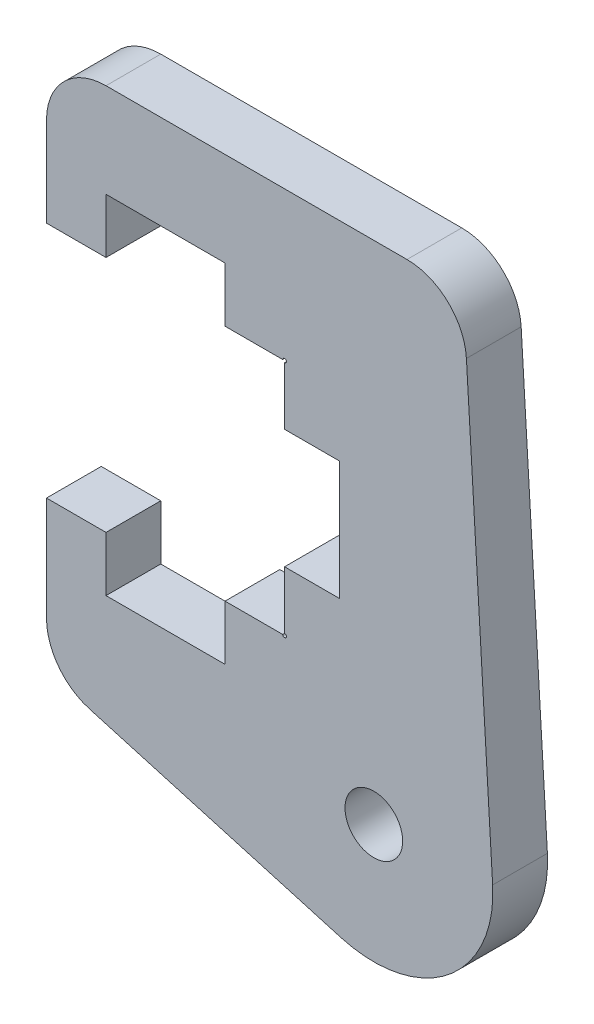
ISO-10303-21;
HEADER;
FILE_DESCRIPTION(('STEP AP214'),'2;1');
FILE_NAME('part.step','',(''),(''),'','','');
FILE_SCHEMA(('AUTOMOTIVE_DESIGN { 1 0 10303 214 1 1 1 1 }'));
ENDSEC;
DATA;
#1=APPLICATION_CONTEXT('core data for automotive mechanical design processes');
#2=APPLICATION_PROTOCOL_DEFINITION('international standard','automotive_design',2000,#1);
#3=PRODUCT_CONTEXT('',#1,'mechanical');
#4=PRODUCT('Part','Part','',(#3));
#5=PRODUCT_RELATED_PRODUCT_CATEGORY('part','',(#4));
#6=PRODUCT_DEFINITION_FORMATION('','',#4);
#7=PRODUCT_DEFINITION_CONTEXT('part definition',#1,'design');
#8=PRODUCT_DEFINITION('design','',#6,#7);
#9=PRODUCT_DEFINITION_SHAPE('','',#8);
#10=(LENGTH_UNIT() NAMED_UNIT(*) SI_UNIT(.MILLI.,.METRE.));
#11=(NAMED_UNIT(*) PLANE_ANGLE_UNIT() SI_UNIT($,.RADIAN.));
#12=(NAMED_UNIT(*) SI_UNIT($,.STERADIAN.) SOLID_ANGLE_UNIT());
#13=UNCERTAINTY_MEASURE_WITH_UNIT(LENGTH_MEASURE(1.E-05),#10,'distance_accuracy_value','');
#14=(GEOMETRIC_REPRESENTATION_CONTEXT(3) GLOBAL_UNCERTAINTY_ASSIGNED_CONTEXT((#13)) GLOBAL_UNIT_ASSIGNED_CONTEXT((#10,
#11,#12)) REPRESENTATION_CONTEXT('',''));
#15=CARTESIAN_POINT('',(0.,0.,0.));
#16=DIRECTION('',(0.,0.,1.));
#17=DIRECTION('',(1.,0.,0.));
#18=AXIS2_PLACEMENT_3D('',#15,#16,#17);
#19=CARTESIAN_POINT('',(22.225,-25.4,5.842));
#20=DIRECTION('',(0.,0.,1.));
#21=DIRECTION('',(1.,0.,0.));
#22=AXIS2_PLACEMENT_3D('',#19,#20,#21);
#23=PLANE('',#22);
#24=CARTESIAN_POINT('',(12.7,-12.7,5.842));
#25=DIRECTION('',(0.,0.,1.));
#26=DIRECTION('',(1.,0.,0.));
#27=AXIS2_PLACEMENT_3D('',#24,#25,#26);
#28=CIRCLE('',#27,0.1984375);
#29=CARTESIAN_POINT('',(12.5015625,-12.7,5.842));
#30=VERTEX_POINT('',#29);
#31=CARTESIAN_POINT('',(12.7,-12.5015625,5.842));
#32=VERTEX_POINT('',#31);
#33=EDGE_CURVE('E205',#30,#32,#28,.T.);
#34=ORIENTED_EDGE('',*,*,#33,.F.);
#35=DIRECTION('',(-1.,0.,0.));
#36=VECTOR('',#35,1.);
#37=CARTESIAN_POINT('',(12.7,-12.7,5.842));
#38=LINE('',#37,#36);
#39=CARTESIAN_POINT('',(6.35,-12.7,5.842));
#40=VERTEX_POINT('',#39);
#41=EDGE_CURVE('E227',#30,#40,#38,.T.);
#42=ORIENTED_EDGE('',*,*,#41,.T.);
#43=DIRECTION('',(0.,-1.,0.));
#44=VECTOR('',#43,1.);
#45=CARTESIAN_POINT('',(6.35,-18.542,5.842));
#46=LINE('',#45,#44);
#47=CARTESIAN_POINT('',(6.35,-18.542,5.842));
#48=VERTEX_POINT('',#47);
#49=EDGE_CURVE('E229',#40,#48,#46,.T.);
#50=ORIENTED_EDGE('',*,*,#49,.T.);
#51=DIRECTION('',(-1.,0.,0.));
#52=VECTOR('',#51,1.);
#53=CARTESIAN_POINT('',(6.35,-18.542,5.842));
#54=LINE('',#53,#52);
#55=CARTESIAN_POINT('',(-6.35,-18.542,5.842));
#56=VERTEX_POINT('',#55);
#57=EDGE_CURVE('E236',#48,#56,#54,.T.);
#58=ORIENTED_EDGE('',*,*,#57,.T.);
#59=DIRECTION('',(0.,1.,0.));
#60=VECTOR('',#59,1.);
#61=CARTESIAN_POINT('',(-6.35,-18.542,5.842));
#62=LINE('',#61,#60);
#63=CARTESIAN_POINT('',(-6.35,-12.7,5.842));
#64=VERTEX_POINT('',#63);
#65=EDGE_CURVE('E238',#56,#64,#62,.T.);
#66=ORIENTED_EDGE('',*,*,#65,.T.);
#67=DIRECTION('',(-1.,0.,0.));
#68=VECTOR('',#67,1.);
#69=CARTESIAN_POINT('',(-6.35,-12.7,5.842));
#70=LINE('',#69,#68);
#71=CARTESIAN_POINT('',(-12.7,-12.7,5.842));
#72=VERTEX_POINT('',#71);
#73=EDGE_CURVE('E240',#64,#72,#70,.T.);
#74=ORIENTED_EDGE('',*,*,#73,.T.);
#75=DIRECTION('',(0.,-1.,0.));
#76=VECTOR('',#75,1.);
#77=CARTESIAN_POINT('',(-12.7,-12.7,5.842));
#78=LINE('',#77,#76);
#79=CARTESIAN_POINT('',(-12.7,-23.7931832403155,5.842));
#80=VERTEX_POINT('',#79);
#81=EDGE_CURVE('E242',#72,#80,#78,.T.);
#82=ORIENTED_EDGE('',*,*,#81,.T.);
#83=CARTESIAN_POINT('',(-6.35000000000001,-23.7931832403155,5.842));
#84=DIRECTION('',(0.,0.,1.));
#85=DIRECTION('',(1.,0.,0.));
#86=AXIS2_PLACEMENT_3D('',#83,#84,#85);
#87=CIRCLE('',#86,6.35);
#88=CARTESIAN_POINT('',(-8.10428482462896,-29.896050169397,5.842));
#89=VERTEX_POINT('',#88);
#90=EDGE_CURVE('E367',#80,#89,#87,.T.);
#91=ORIENTED_EDGE('',*,*,#90,.T.);
#92=DIRECTION('',(0.961081406154566,-0.276265326713221,0.));
#93=VECTOR('',#92,1.);
#94=CARTESIAN_POINT('',(-12.7,-28.575,5.842));
#95=LINE('',#94,#93);
#96=CARTESIAN_POINT('',(18.7164303507421,-37.605733858163,5.842));
#97=VERTEX_POINT('',#96);
#98=EDGE_CURVE('E245',#89,#97,#95,.T.);
#99=ORIENTED_EDGE('',*,*,#98,.T.);
#100=CARTESIAN_POINT('',(22.225,-25.4,5.842));
#101=DIRECTION('',(0.,0.,1.));
#102=DIRECTION('',(1.,0.,0.));
#103=AXIS2_PLACEMENT_3D('',#100,#101,#102);
#104=CIRCLE('',#103,12.7);
#105=CARTESIAN_POINT('',(34.9027769435131,-24.64901946062,5.842));
#106=VERTEX_POINT('',#105);
#107=EDGE_CURVE('E247',#97,#106,#104,.T.);
#108=ORIENTED_EDGE('',*,*,#107,.T.);
#109=DIRECTION('',(-0.0591323259354364,0.998250153032528,0.));
#110=VECTOR('',#109,1.);
#111=CARTESIAN_POINT('',(31.75,28.575,5.842));
#112=LINE('',#111,#110);
#113=CARTESIAN_POINT('',(32.1039059379093,22.60049026969,5.842));
#114=VERTEX_POINT('',#113);
#115=EDGE_CURVE('E249',#106,#114,#112,.T.);
#116=ORIENTED_EDGE('',*,*,#115,.T.);
#117=CARTESIAN_POINT('',(25.7650174661528,22.225,5.842));
#118=DIRECTION('',(0.,0.,1.));
#119=DIRECTION('',(1.,0.,0.));
#120=AXIS2_PLACEMENT_3D('',#117,#118,#119);
#121=CIRCLE('',#120,6.35);
#122=CARTESIAN_POINT('',(25.7650174661528,28.575,5.842));
#123=VERTEX_POINT('',#122);
#124=EDGE_CURVE('E369',#114,#123,#121,.T.);
#125=ORIENTED_EDGE('',*,*,#124,.T.);
#126=DIRECTION('',(-1.,0.,0.));
#127=VECTOR('',#126,1.);
#128=CARTESIAN_POINT('',(-12.7,28.575,5.842));
#129=LINE('',#128,#127);
#130=CARTESIAN_POINT('',(-6.35,28.575,5.842));
#131=VERTEX_POINT('',#130);
#132=EDGE_CURVE('E252',#123,#131,#129,.T.);
#133=ORIENTED_EDGE('',*,*,#132,.T.);
#134=CARTESIAN_POINT('',(-6.35,22.225,5.842));
#135=DIRECTION('',(0.,0.,1.));
#136=DIRECTION('',(1.,0.,0.));
#137=AXIS2_PLACEMENT_3D('',#134,#135,#136);
#138=CIRCLE('',#137,6.35);
#139=CARTESIAN_POINT('',(-12.7,22.225,5.842));
#140=VERTEX_POINT('',#139);
#141=EDGE_CURVE('E365',#131,#140,#138,.T.);
#142=ORIENTED_EDGE('',*,*,#141,.T.);
#143=DIRECTION('',(0.,-1.,0.));
#144=VECTOR('',#143,1.);
#145=CARTESIAN_POINT('',(-12.7,12.7,5.842));
#146=LINE('',#145,#144);
#147=CARTESIAN_POINT('',(-12.7,12.7,5.842));
#148=VERTEX_POINT('',#147);
#149=EDGE_CURVE('E255',#140,#148,#146,.T.);
#150=ORIENTED_EDGE('',*,*,#149,.T.);
#151=DIRECTION('',(1.,0.,0.));
#152=VECTOR('',#151,1.);
#153=CARTESIAN_POINT('',(-6.35,12.7,5.842));
#154=LINE('',#153,#152);
#155=CARTESIAN_POINT('',(-6.35,12.7,5.842));
#156=VERTEX_POINT('',#155);
#157=EDGE_CURVE('E305',#148,#156,#154,.T.);
#158=ORIENTED_EDGE('',*,*,#157,.T.);
#159=DIRECTION('',(0.,1.,0.));
#160=VECTOR('',#159,1.);
#161=CARTESIAN_POINT('',(-6.35,18.542,5.842));
#162=LINE('',#161,#160);
#163=CARTESIAN_POINT('',(-6.35,18.542,5.842));
#164=VERTEX_POINT('',#163);
#165=EDGE_CURVE('E412',#156,#164,#162,.T.);
#166=ORIENTED_EDGE('',*,*,#165,.T.);
#167=DIRECTION('',(1.,0.,0.));
#168=VECTOR('',#167,1.);
#169=CARTESIAN_POINT('',(6.35,18.542,5.842));
#170=LINE('',#169,#168);
#171=CARTESIAN_POINT('',(6.35,18.542,5.842));
#172=VERTEX_POINT('',#171);
#173=EDGE_CURVE('E410',#164,#172,#170,.T.);
#174=ORIENTED_EDGE('',*,*,#173,.T.);
#175=DIRECTION('',(0.,-1.,0.));
#176=VECTOR('',#175,1.);
#177=CARTESIAN_POINT('',(6.35,18.542,5.842));
#178=LINE('',#177,#176);
#179=CARTESIAN_POINT('',(6.35,12.7,5.842));
#180=VERTEX_POINT('',#179);
#181=EDGE_CURVE('E408',#172,#180,#178,.T.);
#182=ORIENTED_EDGE('',*,*,#181,.T.);
#183=DIRECTION('',(1.,0.,0.));
#184=VECTOR('',#183,1.);
#185=CARTESIAN_POINT('',(12.7,12.7,5.842));
#186=LINE('',#185,#184);
#187=CARTESIAN_POINT('',(12.5015625,12.7,5.842));
#188=VERTEX_POINT('',#187);
#189=EDGE_CURVE('E405',#180,#188,#186,.T.);
#190=ORIENTED_EDGE('',*,*,#189,.T.);
#191=CARTESIAN_POINT('',(12.7,12.7,5.842));
#192=DIRECTION('',(0.,0.,1.));
#193=DIRECTION('',(1.,0.,0.));
#194=AXIS2_PLACEMENT_3D('',#191,#192,#193);
#195=CIRCLE('',#194,0.198437499999998);
#196=CARTESIAN_POINT('',(12.7,12.5015625,5.842));
#197=VERTEX_POINT('',#196);
#198=EDGE_CURVE('E221',#197,#188,#195,.T.);
#199=ORIENTED_EDGE('',*,*,#198,.F.);
#200=DIRECTION('',(0.,-1.,0.));
#201=VECTOR('',#200,1.);
#202=CARTESIAN_POINT('',(12.7,6.35,5.842));
#203=LINE('',#202,#201);
#204=CARTESIAN_POINT('',(12.7,6.35,5.842));
#205=VERTEX_POINT('',#204);
#206=EDGE_CURVE('E383',#197,#205,#203,.T.);
#207=ORIENTED_EDGE('',*,*,#206,.T.);
#208=DIRECTION('',(1.,0.,0.));
#209=VECTOR('',#208,1.);
#210=CARTESIAN_POINT('',(18.542,6.35,5.842));
#211=LINE('',#210,#209);
#212=CARTESIAN_POINT('',(18.542,6.35,5.842));
#213=VERTEX_POINT('',#212);
#214=EDGE_CURVE('E401',#205,#213,#211,.T.);
#215=ORIENTED_EDGE('',*,*,#214,.T.);
#216=DIRECTION('',(0.,-1.,0.));
#217=VECTOR('',#216,1.);
#218=CARTESIAN_POINT('',(18.542,-6.35,5.842));
#219=LINE('',#218,#217);
#220=CARTESIAN_POINT('',(18.542,-6.35,5.842));
#221=VERTEX_POINT('',#220);
#222=EDGE_CURVE('E231',#213,#221,#219,.T.);
#223=ORIENTED_EDGE('',*,*,#222,.T.);
#224=DIRECTION('',(-1.,0.,0.));
#225=VECTOR('',#224,1.);
#226=CARTESIAN_POINT('',(18.542,-6.35,5.842));
#227=LINE('',#226,#225);
#228=CARTESIAN_POINT('',(12.7,-6.35,5.842));
#229=VERTEX_POINT('',#228);
#230=EDGE_CURVE('E225',#221,#229,#227,.T.);
#231=ORIENTED_EDGE('',*,*,#230,.T.);
#232=DIRECTION('',(0.,-1.,0.));
#233=VECTOR('',#232,1.);
#234=CARTESIAN_POINT('',(12.7,-12.7,5.842));
#235=LINE('',#234,#233);
#236=EDGE_CURVE('E218',#229,#32,#235,.T.);
#237=ORIENTED_EDGE('',*,*,#236,.T.);
#238=EDGE_LOOP('',(#34,#42,#50,#58,#66,#74,#82,#91,#99,#108,#116,#125,#133,#142,#150,#158,#166,
#174,#182,#190,#199,#207,#215,#223,#231,#237));
#239=FACE_BOUND('',#238,.T.);
#240=CARTESIAN_POINT('',(22.225,-25.4,5.842));
#241=DIRECTION('',(0.,0.,1.));
#242=DIRECTION('',(1.,0.,0.));
#243=AXIS2_PLACEMENT_3D('',#240,#241,#242);
#244=CIRCLE('',#243,3.075);
#245=CARTESIAN_POINT('',(25.3,-25.4,5.842));
#246=VERTEX_POINT('',#245);
#247=EDGE_CURVE('E262',#246,#246,#244,.T.);
#248=ORIENTED_EDGE('',*,*,#247,.F.);
#249=EDGE_LOOP('',(#248));
#250=FACE_BOUND('',#249,.T.);
#251=ADVANCED_FACE('F35',(#239,#250),#23,.T.);
#252=CARTESIAN_POINT('',(22.225,-25.4,0.));
#253=DIRECTION('',(0.,0.,1.));
#254=DIRECTION('',(1.,0.,0.));
#255=AXIS2_PLACEMENT_3D('',#252,#253,#254);
#256=PLANE('',#255);
#257=DIRECTION('',(-1.,0.,0.));
#258=VECTOR('',#257,1.);
#259=CARTESIAN_POINT('',(12.7,-12.7,0.));
#260=LINE('',#259,#258);
#261=CARTESIAN_POINT('',(12.5015625,-12.7,0.));
#262=VERTEX_POINT('',#261);
#263=CARTESIAN_POINT('',(6.35,-12.7,0.));
#264=VERTEX_POINT('',#263);
#265=EDGE_CURVE('E280',#262,#264,#260,.T.);
#266=ORIENTED_EDGE('',*,*,#265,.F.);
#267=CARTESIAN_POINT('',(12.7,-12.7,0.));
#268=DIRECTION('',(0.,0.,1.));
#269=DIRECTION('',(1.,0.,0.));
#270=AXIS2_PLACEMENT_3D('',#267,#268,#269);
#271=CIRCLE('',#270,0.1984375);
#272=CARTESIAN_POINT('',(12.7,-12.5015625,0.));
#273=VERTEX_POINT('',#272);
#274=EDGE_CURVE('E50',#262,#273,#271,.T.);
#275=ORIENTED_EDGE('',*,*,#274,.T.);
#276=DIRECTION('',(0.,-1.,0.));
#277=VECTOR('',#276,1.);
#278=CARTESIAN_POINT('',(12.7,-12.7,0.));
#279=LINE('',#278,#277);
#280=CARTESIAN_POINT('',(12.7,-6.35,0.));
#281=VERTEX_POINT('',#280);
#282=EDGE_CURVE('E220',#281,#273,#279,.T.);
#283=ORIENTED_EDGE('',*,*,#282,.F.);
#284=DIRECTION('',(-1.,0.,0.));
#285=VECTOR('',#284,1.);
#286=CARTESIAN_POINT('',(18.542,-6.35,0.));
#287=LINE('',#286,#285);
#288=CARTESIAN_POINT('',(18.542,-6.35,0.));
#289=VERTEX_POINT('',#288);
#290=EDGE_CURVE('E277',#289,#281,#287,.T.);
#291=ORIENTED_EDGE('',*,*,#290,.F.);
#292=DIRECTION('',(0.,-1.,0.));
#293=VECTOR('',#292,1.);
#294=CARTESIAN_POINT('',(18.542,-6.35,0.));
#295=LINE('',#294,#293);
#296=CARTESIAN_POINT('',(18.542,6.35,0.));
#297=VERTEX_POINT('',#296);
#298=EDGE_CURVE('E275',#297,#289,#295,.T.);
#299=ORIENTED_EDGE('',*,*,#298,.F.);
#300=DIRECTION('',(1.,0.,0.));
#301=VECTOR('',#300,1.);
#302=CARTESIAN_POINT('',(18.542,6.35,0.));
#303=LINE('',#302,#301);
#304=CARTESIAN_POINT('',(12.7,6.35,0.));
#305=VERTEX_POINT('',#304);
#306=EDGE_CURVE('E273',#305,#297,#303,.T.);
#307=ORIENTED_EDGE('',*,*,#306,.F.);
#308=DIRECTION('',(0.,-1.,0.));
#309=VECTOR('',#308,1.);
#310=CARTESIAN_POINT('',(12.7,6.35,0.));
#311=LINE('',#310,#309);
#312=CARTESIAN_POINT('',(12.7,12.5015625,0.));
#313=VERTEX_POINT('',#312);
#314=EDGE_CURVE('E271',#313,#305,#311,.T.);
#315=ORIENTED_EDGE('',*,*,#314,.F.);
#316=CARTESIAN_POINT('',(12.7,12.7,0.));
#317=DIRECTION('',(0.,0.,1.));
#318=DIRECTION('',(1.,0.,0.));
#319=AXIS2_PLACEMENT_3D('',#316,#317,#318);
#320=CIRCLE('',#319,0.198437499999998);
#321=CARTESIAN_POINT('',(12.5015625,12.7,0.));
#322=VERTEX_POINT('',#321);
#323=EDGE_CURVE('E57',#313,#322,#320,.T.);
#324=ORIENTED_EDGE('',*,*,#323,.T.);
#325=DIRECTION('',(1.,0.,0.));
#326=VECTOR('',#325,1.);
#327=CARTESIAN_POINT('',(12.7,12.7,0.));
#328=LINE('',#327,#326);
#329=CARTESIAN_POINT('',(6.35,12.7,0.));
#330=VERTEX_POINT('',#329);
#331=EDGE_CURVE('E268',#330,#322,#328,.T.);
#332=ORIENTED_EDGE('',*,*,#331,.F.);
#333=DIRECTION('',(0.,-1.,0.));
#334=VECTOR('',#333,1.);
#335=CARTESIAN_POINT('',(6.35,18.542,0.));
#336=LINE('',#335,#334);
#337=CARTESIAN_POINT('',(6.35,18.542,0.));
#338=VERTEX_POINT('',#337);
#339=EDGE_CURVE('E266',#338,#330,#336,.T.);
#340=ORIENTED_EDGE('',*,*,#339,.F.);
#341=DIRECTION('',(1.,0.,0.));
#342=VECTOR('',#341,1.);
#343=CARTESIAN_POINT('',(6.35,18.542,0.));
#344=LINE('',#343,#342);
#345=CARTESIAN_POINT('',(-6.35,18.542,0.));
#346=VERTEX_POINT('',#345);
#347=EDGE_CURVE('E264',#346,#338,#344,.T.);
#348=ORIENTED_EDGE('',*,*,#347,.F.);
#349=DIRECTION('',(0.,1.,0.));
#350=VECTOR('',#349,1.);
#351=CARTESIAN_POINT('',(-6.35,18.542,0.));
#352=LINE('',#351,#350);
#353=CARTESIAN_POINT('',(-6.35,12.7,0.));
#354=VERTEX_POINT('',#353);
#355=EDGE_CURVE('E261',#354,#346,#352,.T.);
#356=ORIENTED_EDGE('',*,*,#355,.F.);
#357=DIRECTION('',(1.,0.,0.));
#358=VECTOR('',#357,1.);
#359=CARTESIAN_POINT('',(-6.35,12.7,0.));
#360=LINE('',#359,#358);
#361=CARTESIAN_POINT('',(-12.7,12.7,0.));
#362=VERTEX_POINT('',#361);
#363=EDGE_CURVE('E258',#362,#354,#360,.T.);
#364=ORIENTED_EDGE('',*,*,#363,.F.);
#365=DIRECTION('',(0.,-1.,0.));
#366=VECTOR('',#365,1.);
#367=CARTESIAN_POINT('',(-12.7,12.7,0.));
#368=LINE('',#367,#366);
#369=CARTESIAN_POINT('',(-12.7,22.225,0.));
#370=VERTEX_POINT('',#369);
#371=EDGE_CURVE('E303',#370,#362,#368,.T.);
#372=ORIENTED_EDGE('',*,*,#371,.F.);
#373=CARTESIAN_POINT('',(-6.35,22.225,0.));
#374=DIRECTION('',(0.,0.,1.));
#375=DIRECTION('',(1.,0.,0.));
#376=AXIS2_PLACEMENT_3D('',#373,#374,#375);
#377=CIRCLE('',#376,6.35);
#378=CARTESIAN_POINT('',(-6.35,28.575,0.));
#379=VERTEX_POINT('',#378);
#380=EDGE_CURVE('E357',#370,#379,#377,.F.);
#381=ORIENTED_EDGE('',*,*,#380,.T.);
#382=DIRECTION('',(-1.,0.,0.));
#383=VECTOR('',#382,1.);
#384=CARTESIAN_POINT('',(-12.7,28.575,0.));
#385=LINE('',#384,#383);
#386=CARTESIAN_POINT('',(25.7650174661528,28.575,0.));
#387=VERTEX_POINT('',#386);
#388=EDGE_CURVE('E300',#387,#379,#385,.T.);
#389=ORIENTED_EDGE('',*,*,#388,.F.);
#390=CARTESIAN_POINT('',(25.7650174661528,22.225,0.));
#391=DIRECTION('',(0.,0.,1.));
#392=DIRECTION('',(1.,0.,0.));
#393=AXIS2_PLACEMENT_3D('',#390,#391,#392);
#394=CIRCLE('',#393,6.35);
#395=CARTESIAN_POINT('',(32.1039059379093,22.60049026969,0.));
#396=VERTEX_POINT('',#395);
#397=EDGE_CURVE('E361',#387,#396,#394,.F.);
#398=ORIENTED_EDGE('',*,*,#397,.T.);
#399=DIRECTION('',(-0.0591323259354364,0.998250153032528,0.));
#400=VECTOR('',#399,1.);
#401=CARTESIAN_POINT('',(31.75,28.575,0.));
#402=LINE('',#401,#400);
#403=CARTESIAN_POINT('',(34.9027769435131,-24.64901946062,0.));
#404=VERTEX_POINT('',#403);
#405=EDGE_CURVE('E297',#404,#396,#402,.T.);
#406=ORIENTED_EDGE('',*,*,#405,.F.);
#407=CARTESIAN_POINT('',(22.225,-25.4,0.));
#408=DIRECTION('',(0.,0.,1.));
#409=DIRECTION('',(1.,0.,0.));
#410=AXIS2_PLACEMENT_3D('',#407,#408,#409);
#411=CIRCLE('',#410,12.7);
#412=CARTESIAN_POINT('',(18.7164303507421,-37.605733858163,0.));
#413=VERTEX_POINT('',#412);
#414=EDGE_CURVE('E295',#413,#404,#411,.T.);
#415=ORIENTED_EDGE('',*,*,#414,.F.);
#416=DIRECTION('',(0.961081406154566,-0.276265326713221,0.));
#417=VECTOR('',#416,1.);
#418=CARTESIAN_POINT('',(-12.7,-28.575,0.));
#419=LINE('',#418,#417);
#420=CARTESIAN_POINT('',(-8.10428482462896,-29.896050169397,0.));
#421=VERTEX_POINT('',#420);
#422=EDGE_CURVE('E293',#421,#413,#419,.T.);
#423=ORIENTED_EDGE('',*,*,#422,.F.);
#424=CARTESIAN_POINT('',(-6.35000000000001,-23.7931832403155,0.));
#425=DIRECTION('',(0.,0.,1.));
#426=DIRECTION('',(1.,0.,0.));
#427=AXIS2_PLACEMENT_3D('',#424,#425,#426);
#428=CIRCLE('',#427,6.35);
#429=CARTESIAN_POINT('',(-12.7,-23.7931832403155,0.));
#430=VERTEX_POINT('',#429);
#431=EDGE_CURVE('E359',#421,#430,#428,.F.);
#432=ORIENTED_EDGE('',*,*,#431,.T.);
#433=DIRECTION('',(0.,-1.,0.));
#434=VECTOR('',#433,1.);
#435=CARTESIAN_POINT('',(-12.7,-12.7,0.));
#436=LINE('',#435,#434);
#437=CARTESIAN_POINT('',(-12.7,-12.7,0.));
#438=VERTEX_POINT('',#437);
#439=EDGE_CURVE('E290',#438,#430,#436,.T.);
#440=ORIENTED_EDGE('',*,*,#439,.F.);
#441=DIRECTION('',(-1.,0.,0.));
#442=VECTOR('',#441,1.);
#443=CARTESIAN_POINT('',(-6.35,-12.7,0.));
#444=LINE('',#443,#442);
#445=CARTESIAN_POINT('',(-6.35,-12.7,0.));
#446=VERTEX_POINT('',#445);
#447=EDGE_CURVE('E288',#446,#438,#444,.T.);
#448=ORIENTED_EDGE('',*,*,#447,.F.);
#449=DIRECTION('',(0.,1.,0.));
#450=VECTOR('',#449,1.);
#451=CARTESIAN_POINT('',(-6.35,-18.542,0.));
#452=LINE('',#451,#450);
#453=CARTESIAN_POINT('',(-6.35,-18.542,0.));
#454=VERTEX_POINT('',#453);
#455=EDGE_CURVE('E286',#454,#446,#452,.T.);
#456=ORIENTED_EDGE('',*,*,#455,.F.);
#457=DIRECTION('',(-1.,0.,0.));
#458=VECTOR('',#457,1.);
#459=CARTESIAN_POINT('',(6.35,-18.542,0.));
#460=LINE('',#459,#458);
#461=CARTESIAN_POINT('',(6.35,-18.542,0.));
#462=VERTEX_POINT('',#461);
#463=EDGE_CURVE('E284',#462,#454,#460,.T.);
#464=ORIENTED_EDGE('',*,*,#463,.F.);
#465=DIRECTION('',(0.,-1.,0.));
#466=VECTOR('',#465,1.);
#467=CARTESIAN_POINT('',(6.35,-18.542,0.));
#468=LINE('',#467,#466);
#469=EDGE_CURVE('E282',#264,#462,#468,.T.);
#470=ORIENTED_EDGE('',*,*,#469,.F.);
#471=EDGE_LOOP('',(#266,#275,#283,#291,#299,#307,#315,#324,#332,#340,#348,#356,#364,#372,#381,
#389,#398,#406,#415,#423,#432,#440,#448,#456,#464,#470));
#472=FACE_BOUND('',#471,.T.);
#473=CARTESIAN_POINT('',(22.225,-25.4,0.));
#474=DIRECTION('',(0.,0.,1.));
#475=DIRECTION('',(1.,0.,0.));
#476=AXIS2_PLACEMENT_3D('',#473,#474,#475);
#477=CIRCLE('',#476,3.075);
#478=CARTESIAN_POINT('',(25.3,-25.4,0.));
#479=VERTEX_POINT('',#478);
#480=EDGE_CURVE('E416',#479,#479,#477,.T.);
#481=ORIENTED_EDGE('',*,*,#480,.T.);
#482=EDGE_LOOP('',(#481));
#483=FACE_BOUND('',#482,.T.);
#484=ADVANCED_FACE('F388',(#472,#483),#256,.F.);
#485=CARTESIAN_POINT('',(-6.35,12.7,5.842));
#486=DIRECTION('',(0.,1.,0.));
#487=DIRECTION('',(-1.,0.,0.));
#488=AXIS2_PLACEMENT_3D('',#485,#486,#487);
#489=PLANE('',#488);
#490=ORIENTED_EDGE('',*,*,#363,.T.);
#491=DIRECTION('',(0.,0.,-1.));
#492=VECTOR('',#491,1.);
#493=CARTESIAN_POINT('',(-6.35,12.7,5.842));
#494=LINE('',#493,#492);
#495=EDGE_CURVE('E349',#156,#354,#494,.T.);
#496=ORIENTED_EDGE('',*,*,#495,.F.);
#497=ORIENTED_EDGE('',*,*,#157,.F.);
#498=DIRECTION('',(0.,0.,-1.));
#499=VECTOR('',#498,1.);
#500=CARTESIAN_POINT('',(-12.7,12.7,5.842));
#501=LINE('',#500,#499);
#502=EDGE_CURVE('E257',#148,#362,#501,.T.);
#503=ORIENTED_EDGE('',*,*,#502,.T.);
#504=EDGE_LOOP('',(#490,#496,#497,#503));
#505=FACE_BOUND('',#504,.T.);
#506=ADVANCED_FACE('F494',(#505),#489,.F.);
#507=CARTESIAN_POINT('',(-6.35,18.542,5.842));
#508=DIRECTION('',(-1.,0.,0.));
#509=DIRECTION('',(0.,0.,1.));
#510=AXIS2_PLACEMENT_3D('',#507,#508,#509);
#511=PLANE('',#510);
#512=ORIENTED_EDGE('',*,*,#355,.T.);
#513=DIRECTION('',(0.,0.,-1.));
#514=VECTOR('',#513,1.);
#515=CARTESIAN_POINT('',(-6.35,18.542,5.842));
#516=LINE('',#515,#514);
#517=EDGE_CURVE('E346',#164,#346,#516,.T.);
#518=ORIENTED_EDGE('',*,*,#517,.F.);
#519=ORIENTED_EDGE('',*,*,#165,.F.);
#520=ORIENTED_EDGE('',*,*,#495,.T.);
#521=EDGE_LOOP('',(#512,#518,#519,#520));
#522=FACE_BOUND('',#521,.T.);
#523=ADVANCED_FACE('F496',(#522),#511,.F.);
#524=CARTESIAN_POINT('',(6.35,18.542,5.842));
#525=DIRECTION('',(0.,1.,0.));
#526=DIRECTION('',(0.,0.,1.));
#527=AXIS2_PLACEMENT_3D('',#524,#525,#526);
#528=PLANE('',#527);
#529=ORIENTED_EDGE('',*,*,#347,.T.);
#530=DIRECTION('',(0.,0.,-1.));
#531=VECTOR('',#530,1.);
#532=CARTESIAN_POINT('',(6.35,18.542,5.842));
#533=LINE('',#532,#531);
#534=EDGE_CURVE('E343',#172,#338,#533,.T.);
#535=ORIENTED_EDGE('',*,*,#534,.F.);
#536=ORIENTED_EDGE('',*,*,#173,.F.);
#537=ORIENTED_EDGE('',*,*,#517,.T.);
#538=EDGE_LOOP('',(#529,#535,#536,#537));
#539=FACE_BOUND('',#538,.T.);
#540=ADVANCED_FACE('F501',(#539),#528,.F.);
#541=CARTESIAN_POINT('',(6.35,18.542,5.842));
#542=DIRECTION('',(1.,0.,0.));
#543=DIRECTION('',(0.,1.,0.));
#544=AXIS2_PLACEMENT_3D('',#541,#542,#543);
#545=PLANE('',#544);
#546=ORIENTED_EDGE('',*,*,#339,.T.);
#547=DIRECTION('',(0.,0.,-1.));
#548=VECTOR('',#547,1.);
#549=CARTESIAN_POINT('',(6.35,12.7,5.842));
#550=LINE('',#549,#548);
#551=EDGE_CURVE('E340',#180,#330,#550,.T.);
#552=ORIENTED_EDGE('',*,*,#551,.F.);
#553=ORIENTED_EDGE('',*,*,#181,.F.);
#554=ORIENTED_EDGE('',*,*,#534,.T.);
#555=EDGE_LOOP('',(#546,#552,#553,#554));
#556=FACE_BOUND('',#555,.T.);
#557=ADVANCED_FACE('F506',(#556),#545,.F.);
#558=CARTESIAN_POINT('',(12.7,12.7,5.842));
#559=DIRECTION('',(0.,1.,0.));
#560=DIRECTION('',(-1.,0.,0.));
#561=AXIS2_PLACEMENT_3D('',#558,#559,#560);
#562=PLANE('',#561);
#563=ORIENTED_EDGE('',*,*,#331,.T.);
#564=DIRECTION('',(0.,0.,1.));
#565=VECTOR('',#564,1.);
#566=CARTESIAN_POINT('',(12.5015625,12.7,0.));
#567=LINE('',#566,#565);
#568=EDGE_CURVE('E419',#322,#188,#567,.T.);
#569=ORIENTED_EDGE('',*,*,#568,.T.);
#570=ORIENTED_EDGE('',*,*,#189,.F.);
#571=ORIENTED_EDGE('',*,*,#551,.T.);
#572=EDGE_LOOP('',(#563,#569,#570,#571));
#573=FACE_BOUND('',#572,.T.);
#574=ADVANCED_FACE('F509',(#573),#562,.F.);
#575=CARTESIAN_POINT('',(12.7,6.35,5.842));
#576=DIRECTION('',(1.,0.,0.));
#577=DIRECTION('',(0.,0.,-1.));
#578=AXIS2_PLACEMENT_3D('',#575,#576,#577);
#579=PLANE('',#578);
#580=ORIENTED_EDGE('',*,*,#206,.F.);
#581=DIRECTION('',(0.,0.,1.));
#582=VECTOR('',#581,1.);
#583=CARTESIAN_POINT('',(12.7,12.5015625,0.));
#584=LINE('',#583,#582);
#585=EDGE_CURVE('E43',#197,#313,#584,.F.);
#586=ORIENTED_EDGE('',*,*,#585,.T.);
#587=ORIENTED_EDGE('',*,*,#314,.T.);
#588=DIRECTION('',(0.,0.,-1.));
#589=VECTOR('',#588,1.);
#590=CARTESIAN_POINT('',(12.7,6.35,5.842));
#591=LINE('',#590,#589);
#592=EDGE_CURVE('E337',#205,#305,#591,.T.);
#593=ORIENTED_EDGE('',*,*,#592,.F.);
#594=EDGE_LOOP('',(#580,#586,#587,#593));
#595=FACE_BOUND('',#594,.T.);
#596=ADVANCED_FACE('F381',(#595),#579,.F.);
#597=CARTESIAN_POINT('',(18.542,6.35,5.842));
#598=DIRECTION('',(0.,1.,0.));
#599=DIRECTION('',(0.,0.,1.));
#600=AXIS2_PLACEMENT_3D('',#597,#598,#599);
#601=PLANE('',#600);
#602=ORIENTED_EDGE('',*,*,#306,.T.);
#603=DIRECTION('',(0.,0.,-1.));
#604=VECTOR('',#603,1.);
#605=CARTESIAN_POINT('',(18.542,6.35,5.842));
#606=LINE('',#605,#604);
#607=EDGE_CURVE('E334',#213,#297,#606,.T.);
#608=ORIENTED_EDGE('',*,*,#607,.F.);
#609=ORIENTED_EDGE('',*,*,#214,.F.);
#610=ORIENTED_EDGE('',*,*,#592,.T.);
#611=EDGE_LOOP('',(#602,#608,#609,#610));
#612=FACE_BOUND('',#611,.T.);
#613=ADVANCED_FACE('F395',(#612),#601,.F.);
#614=CARTESIAN_POINT('',(18.542,-6.35,5.842));
#615=DIRECTION('',(1.,0.,0.));
#616=DIRECTION('',(0.,0.,-1.));
#617=AXIS2_PLACEMENT_3D('',#614,#615,#616);
#618=PLANE('',#617);
#619=ORIENTED_EDGE('',*,*,#298,.T.);
#620=DIRECTION('',(0.,0.,-1.));
#621=VECTOR('',#620,1.);
#622=CARTESIAN_POINT('',(18.542,-6.35,5.842));
#623=LINE('',#622,#621);
#624=EDGE_CURVE('E331',#221,#289,#623,.T.);
#625=ORIENTED_EDGE('',*,*,#624,.F.);
#626=ORIENTED_EDGE('',*,*,#222,.F.);
#627=ORIENTED_EDGE('',*,*,#607,.T.);
#628=EDGE_LOOP('',(#619,#625,#626,#627));
#629=FACE_BOUND('',#628,.T.);
#630=ADVANCED_FACE('F399',(#629),#618,.F.);
#631=CARTESIAN_POINT('',(18.542,-6.35,5.842));
#632=DIRECTION('',(0.,-1.,0.));
#633=DIRECTION('',(0.,0.,-1.));
#634=AXIS2_PLACEMENT_3D('',#631,#632,#633);
#635=PLANE('',#634);
#636=ORIENTED_EDGE('',*,*,#290,.T.);
#637=DIRECTION('',(0.,0.,-1.));
#638=VECTOR('',#637,1.);
#639=CARTESIAN_POINT('',(12.7,-6.35,5.842));
#640=LINE('',#639,#638);
#641=EDGE_CURVE('E329',#229,#281,#640,.T.);
#642=ORIENTED_EDGE('',*,*,#641,.F.);
#643=ORIENTED_EDGE('',*,*,#230,.F.);
#644=ORIENTED_EDGE('',*,*,#624,.T.);
#645=EDGE_LOOP('',(#636,#642,#643,#644));
#646=FACE_BOUND('',#645,.T.);
#647=ADVANCED_FACE('F552',(#646),#635,.F.);
#648=CARTESIAN_POINT('',(12.7,-12.7,5.842));
#649=DIRECTION('',(1.,0.,0.));
#650=DIRECTION('',(0.,0.,-1.));
#651=AXIS2_PLACEMENT_3D('',#648,#649,#650);
#652=PLANE('',#651);
#653=ORIENTED_EDGE('',*,*,#282,.T.);
#654=DIRECTION('',(0.,0.,1.));
#655=VECTOR('',#654,1.);
#656=CARTESIAN_POINT('',(12.7,-12.5015625,0.));
#657=LINE('',#656,#655);
#658=EDGE_CURVE('E208',#273,#32,#657,.T.);
#659=ORIENTED_EDGE('',*,*,#658,.T.);
#660=ORIENTED_EDGE('',*,*,#236,.F.);
#661=ORIENTED_EDGE('',*,*,#641,.T.);
#662=EDGE_LOOP('',(#653,#659,#660,#661));
#663=FACE_BOUND('',#662,.T.);
#664=ADVANCED_FACE('F216',(#663),#652,.F.);
#665=CARTESIAN_POINT('',(12.7,-12.7,5.842));
#666=DIRECTION('',(0.,-1.,0.));
#667=DIRECTION('',(1.,0.,0.));
#668=AXIS2_PLACEMENT_3D('',#665,#666,#667);
#669=PLANE('',#668);
#670=ORIENTED_EDGE('',*,*,#41,.F.);
#671=DIRECTION('',(0.,0.,1.));
#672=VECTOR('',#671,1.);
#673=CARTESIAN_POINT('',(12.5015625,-12.7,0.));
#674=LINE('',#673,#672);
#675=EDGE_CURVE('E11',#30,#262,#674,.F.);
#676=ORIENTED_EDGE('',*,*,#675,.T.);
#677=ORIENTED_EDGE('',*,*,#265,.T.);
#678=DIRECTION('',(0.,0.,-1.));
#679=VECTOR('',#678,1.);
#680=CARTESIAN_POINT('',(6.35,-12.7,5.842));
#681=LINE('',#680,#679);
#682=EDGE_CURVE('E326',#40,#264,#681,.T.);
#683=ORIENTED_EDGE('',*,*,#682,.F.);
#684=EDGE_LOOP('',(#670,#676,#677,#683));
#685=FACE_BOUND('',#684,.T.);
#686=ADVANCED_FACE('F430',(#685),#669,.F.);
#687=CARTESIAN_POINT('',(6.35,-18.542,5.842));
#688=DIRECTION('',(1.,0.,0.));
#689=DIRECTION('',(0.,1.,0.));
#690=AXIS2_PLACEMENT_3D('',#687,#688,#689);
#691=PLANE('',#690);
#692=ORIENTED_EDGE('',*,*,#469,.T.);
#693=DIRECTION('',(0.,0.,-1.));
#694=VECTOR('',#693,1.);
#695=CARTESIAN_POINT('',(6.35,-18.542,5.842));
#696=LINE('',#695,#694);
#697=EDGE_CURVE('E323',#48,#462,#696,.T.);
#698=ORIENTED_EDGE('',*,*,#697,.F.);
#699=ORIENTED_EDGE('',*,*,#49,.F.);
#700=ORIENTED_EDGE('',*,*,#682,.T.);
#701=EDGE_LOOP('',(#692,#698,#699,#700));
#702=FACE_BOUND('',#701,.T.);
#703=ADVANCED_FACE('F433',(#702),#691,.F.);
#704=CARTESIAN_POINT('',(6.35,-18.542,5.842));
#705=DIRECTION('',(0.,-1.,0.));
#706=DIRECTION('',(1.,0.,0.));
#707=AXIS2_PLACEMENT_3D('',#704,#705,#706);
#708=PLANE('',#707);
#709=ORIENTED_EDGE('',*,*,#463,.T.);
#710=DIRECTION('',(0.,0.,-1.));
#711=VECTOR('',#710,1.);
#712=CARTESIAN_POINT('',(-6.35,-18.542,5.842));
#713=LINE('',#712,#711);
#714=EDGE_CURVE('E320',#56,#454,#713,.T.);
#715=ORIENTED_EDGE('',*,*,#714,.F.);
#716=ORIENTED_EDGE('',*,*,#57,.F.);
#717=ORIENTED_EDGE('',*,*,#697,.T.);
#718=EDGE_LOOP('',(#709,#715,#716,#717));
#719=FACE_BOUND('',#718,.T.);
#720=ADVANCED_FACE('F440',(#719),#708,.F.);
#721=CARTESIAN_POINT('',(-6.35,-18.542,5.842));
#722=DIRECTION('',(-1.,0.,0.));
#723=DIRECTION('',(0.,-1.,0.));
#724=AXIS2_PLACEMENT_3D('',#721,#722,#723);
#725=PLANE('',#724);
#726=ORIENTED_EDGE('',*,*,#455,.T.);
#727=DIRECTION('',(0.,0.,-1.));
#728=VECTOR('',#727,1.);
#729=CARTESIAN_POINT('',(-6.35,-12.7,5.842));
#730=LINE('',#729,#728);
#731=EDGE_CURVE('E317',#64,#446,#730,.T.);
#732=ORIENTED_EDGE('',*,*,#731,.F.);
#733=ORIENTED_EDGE('',*,*,#65,.F.);
#734=ORIENTED_EDGE('',*,*,#714,.T.);
#735=EDGE_LOOP('',(#726,#732,#733,#734));
#736=FACE_BOUND('',#735,.T.);
#737=ADVANCED_FACE('F443',(#736),#725,.F.);
#738=CARTESIAN_POINT('',(-6.35,-12.7,5.842));
#739=DIRECTION('',(0.,-1.,0.));
#740=DIRECTION('',(1.,0.,0.));
#741=AXIS2_PLACEMENT_3D('',#738,#739,#740);
#742=PLANE('',#741);
#743=ORIENTED_EDGE('',*,*,#447,.T.);
#744=DIRECTION('',(0.,0.,-1.));
#745=VECTOR('',#744,1.);
#746=CARTESIAN_POINT('',(-12.7,-12.7,5.842));
#747=LINE('',#746,#745);
#748=EDGE_CURVE('E314',#72,#438,#747,.T.);
#749=ORIENTED_EDGE('',*,*,#748,.F.);
#750=ORIENTED_EDGE('',*,*,#73,.F.);
#751=ORIENTED_EDGE('',*,*,#731,.T.);
#752=EDGE_LOOP('',(#743,#749,#750,#751));
#753=FACE_BOUND('',#752,.T.);
#754=ADVANCED_FACE('F448',(#753),#742,.F.);
#755=CARTESIAN_POINT('',(-12.7,-12.7,5.842));
#756=DIRECTION('',(1.,0.,0.));
#757=DIRECTION('',(0.,1.,0.));
#758=AXIS2_PLACEMENT_3D('',#755,#756,#757);
#759=PLANE('',#758);
#760=ORIENTED_EDGE('',*,*,#439,.T.);
#761=DIRECTION('',(0.,0.,-1.));
#762=VECTOR('',#761,1.);
#763=CARTESIAN_POINT('',(-12.7,-23.7931832403155,5.842));
#764=LINE('',#763,#762);
#765=EDGE_CURVE('E374',#430,#80,#764,.F.);
#766=ORIENTED_EDGE('',*,*,#765,.T.);
#767=ORIENTED_EDGE('',*,*,#81,.F.);
#768=ORIENTED_EDGE('',*,*,#748,.T.);
#769=EDGE_LOOP('',(#760,#766,#767,#768));
#770=FACE_BOUND('',#769,.T.);
#771=ADVANCED_FACE('F537',(#770),#759,.F.);
#772=CARTESIAN_POINT('',(-12.7,-28.575,5.842));
#773=DIRECTION('',(0.276265326713221,0.961081406154566,0.));
#774=DIRECTION('',(-0.961081406154566,0.276265326713221,0.));
#775=AXIS2_PLACEMENT_3D('',#772,#773,#774);
#776=PLANE('',#775);
#777=ORIENTED_EDGE('',*,*,#98,.F.);
#778=DIRECTION('',(0.,0.,-1.));
#779=VECTOR('',#778,1.);
#780=CARTESIAN_POINT('',(-8.10428482462896,-29.896050169397,5.842));
#781=LINE('',#780,#779);
#782=EDGE_CURVE('E371',#89,#421,#781,.T.);
#783=ORIENTED_EDGE('',*,*,#782,.T.);
#784=ORIENTED_EDGE('',*,*,#422,.T.);
#785=DIRECTION('',(0.,0.,-1.));
#786=VECTOR('',#785,1.);
#787=CARTESIAN_POINT('',(18.7164303507421,-37.605733858163,5.842));
#788=LINE('',#787,#786);
#789=EDGE_CURVE('E311',#97,#413,#788,.T.);
#790=ORIENTED_EDGE('',*,*,#789,.F.);
#791=EDGE_LOOP('',(#777,#783,#784,#790));
#792=FACE_BOUND('',#791,.T.);
#793=ADVANCED_FACE('F459',(#792),#776,.F.);
#794=CARTESIAN_POINT('',(22.225,-25.4,5.842));
#795=DIRECTION('',(0.,0.,-1.));
#796=DIRECTION('',(-1.,0.,0.));
#797=AXIS2_PLACEMENT_3D('',#794,#795,#796);
#798=CYLINDRICAL_SURFACE('',#797,12.7);
#799=ORIENTED_EDGE('',*,*,#414,.T.);
#800=DIRECTION('',(0.,0.,-1.));
#801=VECTOR('',#800,1.);
#802=CARTESIAN_POINT('',(34.9027769435131,-24.64901946062,5.842));
#803=LINE('',#802,#801);
#804=EDGE_CURVE('E308',#106,#404,#803,.T.);
#805=ORIENTED_EDGE('',*,*,#804,.F.);
#806=ORIENTED_EDGE('',*,*,#107,.F.);
#807=ORIENTED_EDGE('',*,*,#789,.T.);
#808=EDGE_LOOP('',(#799,#805,#806,#807));
#809=FACE_BOUND('',#808,.T.);
#810=ADVANCED_FACE('F466',(#809),#798,.T.);
#811=CARTESIAN_POINT('',(31.75,28.575,5.842));
#812=DIRECTION('',(-0.998250153032528,-0.0591323259354364,0.));
#813=DIRECTION('',(0.0591323259354364,-0.998250153032528,0.));
#814=AXIS2_PLACEMENT_3D('',#811,#812,#813);
#815=PLANE('',#814);
#816=ORIENTED_EDGE('',*,*,#405,.T.);
#817=DIRECTION('',(0.,0.,-1.));
#818=VECTOR('',#817,1.);
#819=CARTESIAN_POINT('',(32.1039059379093,22.60049026969,5.842));
#820=LINE('',#819,#818);
#821=EDGE_CURVE('E363',#396,#114,#820,.F.);
#822=ORIENTED_EDGE('',*,*,#821,.T.);
#823=ORIENTED_EDGE('',*,*,#115,.F.);
#824=ORIENTED_EDGE('',*,*,#804,.T.);
#825=EDGE_LOOP('',(#816,#822,#823,#824));
#826=FACE_BOUND('',#825,.T.);
#827=ADVANCED_FACE('F470',(#826),#815,.F.);
#828=CARTESIAN_POINT('',(-12.7,28.575,5.842));
#829=DIRECTION('',(0.,-1.,0.));
#830=DIRECTION('',(0.,0.,-1.));
#831=AXIS2_PLACEMENT_3D('',#828,#829,#830);
#832=PLANE('',#831);
#833=ORIENTED_EDGE('',*,*,#132,.F.);
#834=DIRECTION('',(0.,0.,-1.));
#835=VECTOR('',#834,1.);
#836=CARTESIAN_POINT('',(25.7650174661528,28.575,5.842));
#837=LINE('',#836,#835);
#838=EDGE_CURVE('E354',#123,#387,#837,.T.);
#839=ORIENTED_EDGE('',*,*,#838,.T.);
#840=ORIENTED_EDGE('',*,*,#388,.T.);
#841=DIRECTION('',(0.,0.,-1.));
#842=VECTOR('',#841,1.);
#843=CARTESIAN_POINT('',(-6.35,28.575,5.842));
#844=LINE('',#843,#842);
#845=EDGE_CURVE('E352',#379,#131,#844,.F.);
#846=ORIENTED_EDGE('',*,*,#845,.T.);
#847=EDGE_LOOP('',(#833,#839,#840,#846));
#848=FACE_BOUND('',#847,.T.);
#849=ADVANCED_FACE('F479',(#848),#832,.F.);
#850=CARTESIAN_POINT('',(-12.7,12.7,5.842));
#851=DIRECTION('',(1.,0.,0.));
#852=DIRECTION('',(0.,0.,-1.));
#853=AXIS2_PLACEMENT_3D('',#850,#851,#852);
#854=PLANE('',#853);
#855=ORIENTED_EDGE('',*,*,#149,.F.);
#856=DIRECTION('',(0.,0.,-1.));
#857=VECTOR('',#856,1.);
#858=CARTESIAN_POINT('',(-12.7,22.225,5.842));
#859=LINE('',#858,#857);
#860=EDGE_CURVE('E376',#140,#370,#859,.T.);
#861=ORIENTED_EDGE('',*,*,#860,.T.);
#862=ORIENTED_EDGE('',*,*,#371,.T.);
#863=ORIENTED_EDGE('',*,*,#502,.F.);
#864=EDGE_LOOP('',(#855,#861,#862,#863));
#865=FACE_BOUND('',#864,.T.);
#866=ADVANCED_FACE('F488',(#865),#854,.F.);
#867=CARTESIAN_POINT('',(22.225,-25.4,5.842));
#868=DIRECTION('',(0.,0.,-1.));
#869=DIRECTION('',(-1.,0.,0.));
#870=AXIS2_PLACEMENT_3D('',#867,#868,#869);
#871=CYLINDRICAL_SURFACE('',#870,3.075);
#872=ORIENTED_EDGE('',*,*,#247,.T.);
#873=EDGE_LOOP('',(#872));
#874=FACE_BOUND('',#873,.T.);
#875=ORIENTED_EDGE('',*,*,#480,.F.);
#876=EDGE_LOOP('',(#875));
#877=FACE_BOUND('',#876,.T.);
#878=ADVANCED_FACE('F525',(#874,#877),#871,.F.);
#879=CARTESIAN_POINT('',(25.7650174661528,22.225,5.842));
#880=DIRECTION('',(0.,0.,-1.));
#881=DIRECTION('',(-1.,0.,0.));
#882=AXIS2_PLACEMENT_3D('',#879,#880,#881);
#883=CYLINDRICAL_SURFACE('',#882,6.35);
#884=ORIENTED_EDGE('',*,*,#124,.F.);
#885=ORIENTED_EDGE('',*,*,#821,.F.);
#886=ORIENTED_EDGE('',*,*,#397,.F.);
#887=ORIENTED_EDGE('',*,*,#838,.F.);
#888=EDGE_LOOP('',(#884,#885,#886,#887));
#889=FACE_BOUND('',#888,.T.);
#890=ADVANCED_FACE('F476',(#889),#883,.T.);
#891=CARTESIAN_POINT('',(-6.35000000000001,-23.7931832403155,5.842));
#892=DIRECTION('',(0.,0.,-1.));
#893=DIRECTION('',(-1.,0.,0.));
#894=AXIS2_PLACEMENT_3D('',#891,#892,#893);
#895=CYLINDRICAL_SURFACE('',#894,6.35);
#896=ORIENTED_EDGE('',*,*,#90,.F.);
#897=ORIENTED_EDGE('',*,*,#765,.F.);
#898=ORIENTED_EDGE('',*,*,#431,.F.);
#899=ORIENTED_EDGE('',*,*,#782,.F.);
#900=EDGE_LOOP('',(#896,#897,#898,#899));
#901=FACE_BOUND('',#900,.T.);
#902=ADVANCED_FACE('F456',(#901),#895,.T.);
#903=CARTESIAN_POINT('',(-6.35,22.225,5.842));
#904=DIRECTION('',(0.,0.,-1.));
#905=DIRECTION('',(-1.,0.,0.));
#906=AXIS2_PLACEMENT_3D('',#903,#904,#905);
#907=CYLINDRICAL_SURFACE('',#906,6.35);
#908=ORIENTED_EDGE('',*,*,#141,.F.);
#909=ORIENTED_EDGE('',*,*,#845,.F.);
#910=ORIENTED_EDGE('',*,*,#380,.F.);
#911=ORIENTED_EDGE('',*,*,#860,.F.);
#912=EDGE_LOOP('',(#908,#909,#910,#911));
#913=FACE_BOUND('',#912,.T.);
#914=ADVANCED_FACE('F37',(#913),#907,.T.);
#915=CARTESIAN_POINT('',(12.7,12.7,0.));
#916=DIRECTION('',(0.,0.,1.));
#917=DIRECTION('',(1.,0.,0.));
#918=AXIS2_PLACEMENT_3D('',#915,#916,#917);
#919=CYLINDRICAL_SURFACE('',#918,0.198437499999998);
#920=ORIENTED_EDGE('',*,*,#323,.F.);
#921=ORIENTED_EDGE('',*,*,#585,.F.);
#922=ORIENTED_EDGE('',*,*,#198,.T.);
#923=ORIENTED_EDGE('',*,*,#568,.F.);
#924=EDGE_LOOP('',(#920,#921,#922,#923));
#925=FACE_BOUND('',#924,.T.);
#926=ADVANCED_FACE('F510',(#925),#919,.F.);
#927=CARTESIAN_POINT('',(12.7,-12.7,0.));
#928=DIRECTION('',(0.,0.,1.));
#929=DIRECTION('',(1.,0.,0.));
#930=AXIS2_PLACEMENT_3D('',#927,#928,#929);
#931=CYLINDRICAL_SURFACE('',#930,0.1984375);
#932=ORIENTED_EDGE('',*,*,#274,.F.);
#933=ORIENTED_EDGE('',*,*,#675,.F.);
#934=ORIENTED_EDGE('',*,*,#33,.T.);
#935=ORIENTED_EDGE('',*,*,#658,.F.);
#936=EDGE_LOOP('',(#932,#933,#934,#935));
#937=FACE_BOUND('',#936,.T.);
#938=ADVANCED_FACE('F207',(#937),#931,.F.);
#939=CLOSED_SHELL('',(#251,#484,#506,#523,#540,#557,#574,#596,#613,#630,#647,#664,#686,#703,
#720,#737,#754,#771,#793,#810,#827,#849,#866,#878,#890,#902,#914,#926,#938));
#940=MANIFOLD_SOLID_BREP('B2',#939);
#941=ADVANCED_BREP_SHAPE_REPRESENTATION('',(#18,#940),#14);
#942=SHAPE_DEFINITION_REPRESENTATION(#9,#941);
ENDSEC;
END-ISO-10303-21;
